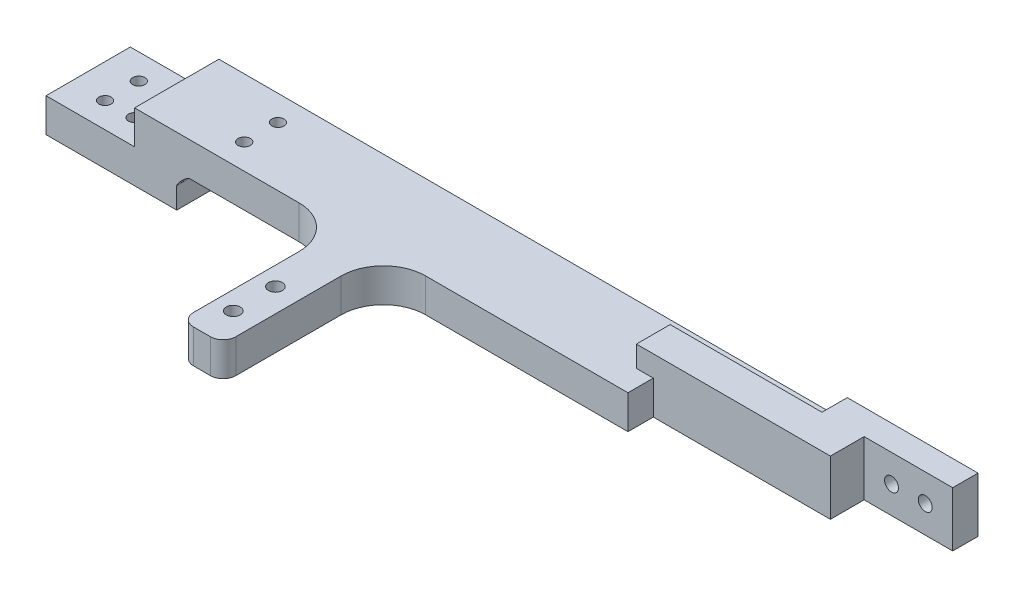
ISO-10303-21;
HEADER;
FILE_DESCRIPTION(('STEP AP214'),'2;1');
FILE_NAME('part.step','',(''),(''),'','','');
FILE_SCHEMA(('AUTOMOTIVE_DESIGN { 1 0 10303 214 1 1 1 1 }'));
ENDSEC;
DATA;
#1=APPLICATION_CONTEXT('core data for automotive mechanical design processes');
#2=APPLICATION_PROTOCOL_DEFINITION('international standard','automotive_design',2000,#1);
#3=PRODUCT_CONTEXT('',#1,'mechanical');
#4=PRODUCT('Part','Part','',(#3));
#5=PRODUCT_RELATED_PRODUCT_CATEGORY('part','',(#4));
#6=PRODUCT_DEFINITION_FORMATION('','',#4);
#7=PRODUCT_DEFINITION_CONTEXT('part definition',#1,'design');
#8=PRODUCT_DEFINITION('design','',#6,#7);
#9=PRODUCT_DEFINITION_SHAPE('','',#8);
#10=(LENGTH_UNIT() NAMED_UNIT(*) SI_UNIT(.MILLI.,.METRE.));
#11=(NAMED_UNIT(*) PLANE_ANGLE_UNIT() SI_UNIT($,.RADIAN.));
#12=(NAMED_UNIT(*) SI_UNIT($,.STERADIAN.) SOLID_ANGLE_UNIT());
#13=UNCERTAINTY_MEASURE_WITH_UNIT(LENGTH_MEASURE(1.E-05),#10,'distance_accuracy_value','');
#14=(GEOMETRIC_REPRESENTATION_CONTEXT(3) GLOBAL_UNCERTAINTY_ASSIGNED_CONTEXT((#13)) GLOBAL_UNIT_ASSIGNED_CONTEXT((#10,
#11,#12)) REPRESENTATION_CONTEXT('',''));
#15=CARTESIAN_POINT('',(0.,0.,0.));
#16=DIRECTION('',(0.,0.,1.));
#17=DIRECTION('',(1.,0.,0.));
#18=AXIS2_PLACEMENT_3D('',#15,#16,#17);
#19=CARTESIAN_POINT('',(0.,8.,20.));
#20=DIRECTION('',(0.,0.,-1.));
#21=DIRECTION('',(-1.,0.,0.));
#22=AXIS2_PLACEMENT_3D('',#19,#20,#21);
#23=PLANE('',#22);
#24=DIRECTION('',(0.,1.,0.));
#25=VECTOR('',#24,1.);
#26=CARTESIAN_POINT('',(68.,-8.,20.));
#27=LINE('',#26,#25);
#28=CARTESIAN_POINT('',(68.,-8.,20.));
#29=VERTEX_POINT('',#28);
#30=CARTESIAN_POINT('',(68.,-3.,20.));
#31=VERTEX_POINT('',#30);
#32=EDGE_CURVE('E491',#29,#31,#27,.T.);
#33=ORIENTED_EDGE('',*,*,#32,.T.);
#34=CARTESIAN_POINT('',(71.,0.,20.));
#35=CARTESIAN_POINT('',(68.,0.,20.));
#36=CARTESIAN_POINT('',(68.,-3.,20.));
#37=(BOUNDED_CURVE() B_SPLINE_CURVE(2,(#34,#35,#36),.UNSPECIFIED.,.F.,
.F.) B_SPLINE_CURVE_WITH_KNOTS((3,3),(0.,1.),
.UNSPECIFIED.) CURVE() GEOMETRIC_REPRESENTATION_ITEM() RATIONAL_B_SPLINE_CURVE((1.,
0.176470588235294,1.)) REPRESENTATION_ITEM(''));
#38=CARTESIAN_POINT('',(71.,0.,20.));
#39=VERTEX_POINT('',#38);
#40=EDGE_CURVE('E348',#31,#39,#37,.F.);
#41=ORIENTED_EDGE('',*,*,#40,.T.);
#42=DIRECTION('',(1.,0.,0.));
#43=VECTOR('',#42,1.);
#44=CARTESIAN_POINT('',(0.,0.,20.));
#45=LINE('',#44,#43);
#46=CARTESIAN_POINT('',(97.,0.,20.));
#47=VERTEX_POINT('',#46);
#48=EDGE_CURVE('E294',#39,#47,#45,.T.);
#49=ORIENTED_EDGE('',*,*,#48,.T.);
#50=DIRECTION('',(0.,-1.,0.));
#51=VECTOR('',#50,1.);
#52=CARTESIAN_POINT('',(97.,8.,20.));
#53=LINE('',#52,#51);
#54=CARTESIAN_POINT('',(97.,8.,20.));
#55=VERTEX_POINT('',#54);
#56=EDGE_CURVE('E600',#47,#55,#53,.F.);
#57=ORIENTED_EDGE('',*,*,#56,.T.);
#58=DIRECTION('',(1.,0.,0.));
#59=VECTOR('',#58,1.);
#60=CARTESIAN_POINT('',(0.,8.,20.));
#61=LINE('',#60,#59);
#62=CARTESIAN_POINT('',(58.,8.,20.));
#63=VERTEX_POINT('',#62);
#64=EDGE_CURVE('E284',#63,#55,#61,.T.);
#65=ORIENTED_EDGE('',*,*,#64,.F.);
#66=DIRECTION('',(0.,1.,0.));
#67=VECTOR('',#66,1.);
#68=CARTESIAN_POINT('',(58.,0.,20.));
#69=LINE('',#68,#67);
#70=CARTESIAN_POINT('',(58.,0.,20.));
#71=VERTEX_POINT('',#70);
#72=EDGE_CURVE('E225',#71,#63,#69,.T.);
#73=ORIENTED_EDGE('',*,*,#72,.F.);
#74=DIRECTION('',(1.,0.,0.));
#75=VECTOR('',#74,1.);
#76=CARTESIAN_POINT('',(37.,0.,20.));
#77=LINE('',#76,#75);
#78=CARTESIAN_POINT('',(37.,0.,20.));
#79=VERTEX_POINT('',#78);
#80=EDGE_CURVE('E210',#79,#71,#77,.T.);
#81=ORIENTED_EDGE('',*,*,#80,.F.);
#82=DIRECTION('',(0.,-1.,0.));
#83=VECTOR('',#82,1.);
#84=CARTESIAN_POINT('',(37.,8.,20.));
#85=LINE('',#84,#83);
#86=CARTESIAN_POINT('',(37.,-8.,20.));
#87=VERTEX_POINT('',#86);
#88=EDGE_CURVE('E222',#79,#87,#85,.T.);
#89=ORIENTED_EDGE('',*,*,#88,.T.);
#90=DIRECTION('',(-1.,0.,0.));
#91=VECTOR('',#90,1.);
#92=CARTESIAN_POINT('',(37.,-8.,20.));
#93=LINE('',#92,#91);
#94=EDGE_CURVE('E489',#29,#87,#93,.T.);
#95=ORIENTED_EDGE('',*,*,#94,.F.);
#96=EDGE_LOOP('',(#33,#41,#49,#57,#65,#73,#81,#89,#95));
#97=FACE_BOUND('',#96,.T.);
#98=ADVANCED_FACE('F39',(#97),#23,.F.);
#99=CARTESIAN_POINT('',(127.,8.,20.));
#100=VERTEX_POINT('',#99);
#101=CARTESIAN_POINT('',(175.,8.,20.));
#102=VERTEX_POINT('',#101);
#103=EDGE_CURVE('E288',#100,#102,#61,.T.);
#104=ORIENTED_EDGE('',*,*,#103,.F.);
#105=DIRECTION('',(0.,1.,0.));
#106=VECTOR('',#105,1.);
#107=CARTESIAN_POINT('',(127.,0.,20.));
#108=LINE('',#107,#106);
#109=CARTESIAN_POINT('',(127.,0.,20.));
#110=VERTEX_POINT('',#109);
#111=EDGE_CURVE('E588',#100,#110,#108,.F.);
#112=ORIENTED_EDGE('',*,*,#111,.T.);
#113=CARTESIAN_POINT('',(175.,0.,20.));
#114=VERTEX_POINT('',#113);
#115=EDGE_CURVE('E283',#110,#114,#45,.T.);
#116=ORIENTED_EDGE('',*,*,#115,.T.);
#117=DIRECTION('',(0.,1.,0.));
#118=VECTOR('',#117,1.);
#119=CARTESIAN_POINT('',(175.,-5.00000000000186,20.));
#120=LINE('',#119,#118);
#121=EDGE_CURVE('E253',#114,#102,#120,.T.);
#122=ORIENTED_EDGE('',*,*,#121,.T.);
#123=EDGE_LOOP('',(#104,#112,#116,#122));
#124=FACE_BOUND('',#123,.T.);
#125=ADVANCED_FACE('F550',(#124),#23,.F.);
#126=CARTESIAN_POINT('',(37.,0.,0.));
#127=DIRECTION('',(1.,0.,0.));
#128=DIRECTION('',(0.,0.,-1.));
#129=AXIS2_PLACEMENT_3D('',#126,#127,#128);
#130=PLANE('',#129);
#131=DIRECTION('',(0.,0.,1.));
#132=VECTOR('',#131,1.);
#133=CARTESIAN_POINT('',(37.,0.,0.));
#134=LINE('',#133,#132);
#135=CARTESIAN_POINT('',(37.,0.,0.));
#136=VERTEX_POINT('',#135);
#137=EDGE_CURVE('E206',#136,#79,#134,.T.);
#138=ORIENTED_EDGE('',*,*,#137,.F.);
#139=DIRECTION('',(0.,1.,0.));
#140=VECTOR('',#139,1.);
#141=CARTESIAN_POINT('',(37.,8.,0.));
#142=LINE('',#141,#140);
#143=CARTESIAN_POINT('',(37.,-8.,0.));
#144=VERTEX_POINT('',#143);
#145=EDGE_CURVE('E232',#144,#136,#142,.T.);
#146=ORIENTED_EDGE('',*,*,#145,.F.);
#147=DIRECTION('',(0.,0.,-1.));
#148=VECTOR('',#147,1.);
#149=CARTESIAN_POINT('',(37.,-8.,20.));
#150=LINE('',#149,#148);
#151=EDGE_CURVE('E231',#87,#144,#150,.T.);
#152=ORIENTED_EDGE('',*,*,#151,.F.);
#153=ORIENTED_EDGE('',*,*,#88,.F.);
#154=EDGE_LOOP('',(#138,#146,#152,#153));
#155=FACE_BOUND('',#154,.T.);
#156=ADVANCED_FACE('F229',(#155),#130,.F.);
#157=CARTESIAN_POINT('',(0.,0.,0.));
#158=DIRECTION('',(0.,1.,0.));
#159=DIRECTION('',(0.,0.,1.));
#160=AXIS2_PLACEMENT_3D('',#157,#158,#159);
#161=PLANE('',#160);
#162=CARTESIAN_POINT('',(111.4,0.,40.));
#163=DIRECTION('',(0.,1.,0.));
#164=DIRECTION('',(0.,0.,1.));
#165=AXIS2_PLACEMENT_3D('',#162,#163,#164);
#166=CIRCLE('',#165,1.65);
#167=CARTESIAN_POINT('',(111.4,0.,41.65));
#168=VERTEX_POINT('',#167);
#169=EDGE_CURVE('E1090',#168,#168,#166,.T.);
#170=ORIENTED_EDGE('',*,*,#169,.T.);
#171=EDGE_LOOP('',(#170));
#172=FACE_BOUND('',#171,.T.);
#173=CARTESIAN_POINT('',(111.4,0.,50.));
#174=DIRECTION('',(0.,1.,0.));
#175=DIRECTION('',(0.,0.,1.));
#176=AXIS2_PLACEMENT_3D('',#173,#174,#175);
#177=CIRCLE('',#176,1.65);
#178=CARTESIAN_POINT('',(111.4,0.,51.65));
#179=VERTEX_POINT('',#178);
#180=EDGE_CURVE('E435',#179,#179,#177,.T.);
#181=ORIENTED_EDGE('',*,*,#180,.T.);
#182=EDGE_LOOP('',(#181));
#183=FACE_BOUND('',#182,.T.);
#184=CARTESIAN_POINT('',(78.,0.,6.));
#185=DIRECTION('',(0.,1.,0.));
#186=DIRECTION('',(0.,0.,1.));
#187=AXIS2_PLACEMENT_3D('',#184,#185,#186);
#188=CIRCLE('',#187,1.45);
#189=CARTESIAN_POINT('',(78.,0.,7.45));
#190=VERTEX_POINT('',#189);
#191=EDGE_CURVE('E248',#190,#190,#188,.T.);
#192=ORIENTED_EDGE('',*,*,#191,.T.);
#193=EDGE_LOOP('',(#192));
#194=FACE_BOUND('',#193,.T.);
#195=CARTESIAN_POINT('',(78.,0.,14.));
#196=DIRECTION('',(0.,1.,0.));
#197=DIRECTION('',(0.,0.,1.));
#198=AXIS2_PLACEMENT_3D('',#195,#196,#197);
#199=CIRCLE('',#198,1.45);
#200=CARTESIAN_POINT('',(78.,0.,15.45));
#201=VERTEX_POINT('',#200);
#202=EDGE_CURVE('E244',#201,#201,#199,.T.);
#203=ORIENTED_EDGE('',*,*,#202,.T.);
#204=EDGE_LOOP('',(#203));
#205=FACE_BOUND('',#204,.T.);
#206=DIRECTION('',(0.,0.,-1.));
#207=VECTOR('',#206,1.);
#208=CARTESIAN_POINT('',(117.,0.,58.));
#209=LINE('',#208,#207);
#210=CARTESIAN_POINT('',(117.,0.,55.));
#211=VERTEX_POINT('',#210);
#212=CARTESIAN_POINT('',(117.,0.,30.));
#213=VERTEX_POINT('',#212);
#214=EDGE_CURVE('E426',#211,#213,#209,.T.);
#215=ORIENTED_EDGE('',*,*,#214,.F.);
#216=CARTESIAN_POINT('',(114.,0.,55.));
#217=DIRECTION('',(0.,1.,0.));
#218=DIRECTION('',(0.,0.,1.));
#219=AXIS2_PLACEMENT_3D('',#216,#217,#218);
#220=CIRCLE('',#219,3.);
#221=CARTESIAN_POINT('',(114.,0.,58.));
#222=VERTEX_POINT('',#221);
#223=EDGE_CURVE('E47',#211,#222,#220,.F.);
#224=ORIENTED_EDGE('',*,*,#223,.T.);
#225=DIRECTION('',(1.,0.,0.));
#226=VECTOR('',#225,1.);
#227=CARTESIAN_POINT('',(107.,0.,58.));
#228=LINE('',#227,#226);
#229=CARTESIAN_POINT('',(110.,0.,58.));
#230=VERTEX_POINT('',#229);
#231=EDGE_CURVE('E424',#230,#222,#228,.T.);
#232=ORIENTED_EDGE('',*,*,#231,.F.);
#233=CARTESIAN_POINT('',(110.,0.,55.));
#234=DIRECTION('',(0.,1.,0.));
#235=DIRECTION('',(0.,0.,1.));
#236=AXIS2_PLACEMENT_3D('',#233,#234,#235);
#237=CIRCLE('',#236,3.);
#238=CARTESIAN_POINT('',(107.,0.,55.));
#239=VERTEX_POINT('',#238);
#240=EDGE_CURVE('E54',#230,#239,#237,.F.);
#241=ORIENTED_EDGE('',*,*,#240,.T.);
#242=DIRECTION('',(0.,0.,-1.));
#243=VECTOR('',#242,1.);
#244=CARTESIAN_POINT('',(107.,0.,58.));
#245=LINE('',#244,#243);
#246=CARTESIAN_POINT('',(107.,0.,30.));
#247=VERTEX_POINT('',#246);
#248=EDGE_CURVE('E447',#239,#247,#245,.T.);
#249=ORIENTED_EDGE('',*,*,#248,.T.);
#250=CARTESIAN_POINT('',(97.,0.,30.));
#251=DIRECTION('',(0.,1.,0.));
#252=DIRECTION('',(0.,0.,1.));
#253=AXIS2_PLACEMENT_3D('',#250,#251,#252);
#254=CIRCLE('',#253,10.);
#255=EDGE_CURVE('E595',#247,#47,#254,.T.);
#256=ORIENTED_EDGE('',*,*,#255,.T.);
#257=ORIENTED_EDGE('',*,*,#48,.F.);
#258=CARTESIAN_POINT('',(71.,0.,-1.));
#259=CARTESIAN_POINT('',(71.,0.,6.33333333333335));
#260=CARTESIAN_POINT('',(71.,0.,13.6666666666666));
#261=CARTESIAN_POINT('',(71.,0.,21.));
#262=(BOUNDED_CURVE() B_SPLINE_CURVE(3,(#258,#259,#260,#261),.UNSPECIFIED.,.F.,
.F.) B_SPLINE_CURVE_WITH_KNOTS((4,4),(-0.001,0.021),
.UNSPECIFIED.) CURVE() GEOMETRIC_REPRESENTATION_ITEM() RATIONAL_B_SPLINE_CURVE((1.,1.,1.,1.)) REPRESENTATION_ITEM(''));
#263=CARTESIAN_POINT('',(71.,0.,0.));
#264=VERTEX_POINT('',#263);
#265=EDGE_CURVE('E306',#39,#264,#262,.F.);
#266=ORIENTED_EDGE('',*,*,#265,.T.);
#267=DIRECTION('',(-1.,0.,0.));
#268=VECTOR('',#267,1.);
#269=CARTESIAN_POINT('',(0.,0.,0.));
#270=LINE('',#269,#268);
#271=CARTESIAN_POINT('',(238.,0.,0.));
#272=VERTEX_POINT('',#271);
#273=EDGE_CURVE('E300',#272,#264,#270,.T.);
#274=ORIENTED_EDGE('',*,*,#273,.F.);
#275=DIRECTION('',(0.,0.,1.));
#276=VECTOR('',#275,1.);
#277=CARTESIAN_POINT('',(238.,0.,0.));
#278=LINE('',#277,#276);
#279=CARTESIAN_POINT('',(238.,0.,6.00000000000001));
#280=VERTEX_POINT('',#279);
#281=EDGE_CURVE('E238',#272,#280,#278,.T.);
#282=ORIENTED_EDGE('',*,*,#281,.T.);
#283=DIRECTION('',(1.,0.,0.));
#284=VECTOR('',#283,1.);
#285=CARTESIAN_POINT('',(217.,0.,6.00000000000001));
#286=LINE('',#285,#284);
#287=CARTESIAN_POINT('',(217.,0.,6.00000000000001));
#288=VERTEX_POINT('',#287);
#289=EDGE_CURVE('E648',#288,#280,#286,.T.);
#290=ORIENTED_EDGE('',*,*,#289,.F.);
#291=DIRECTION('',(0.,0.,-1.));
#292=VECTOR('',#291,1.);
#293=CARTESIAN_POINT('',(217.,0.,6.00000000000001));
#294=LINE('',#293,#292);
#295=CARTESIAN_POINT('',(217.,0.,14.));
#296=VERTEX_POINT('',#295);
#297=EDGE_CURVE('E645',#296,#288,#294,.T.);
#298=ORIENTED_EDGE('',*,*,#297,.F.);
#299=DIRECTION('',(1.,0.,0.));
#300=VECTOR('',#299,1.);
#301=CARTESIAN_POINT('',(241.,0.,14.));
#302=LINE('',#301,#300);
#303=CARTESIAN_POINT('',(175.,0.,14.));
#304=VERTEX_POINT('',#303);
#305=EDGE_CURVE('E278',#304,#296,#302,.T.);
#306=ORIENTED_EDGE('',*,*,#305,.F.);
#307=DIRECTION('',(0.,0.,1.));
#308=VECTOR('',#307,1.);
#309=CARTESIAN_POINT('',(175.,0.,0.));
#310=LINE('',#309,#308);
#311=EDGE_CURVE('E256',#304,#114,#310,.T.);
#312=ORIENTED_EDGE('',*,*,#311,.T.);
#313=ORIENTED_EDGE('',*,*,#115,.F.);
#314=CARTESIAN_POINT('',(127.,0.,30.));
#315=DIRECTION('',(0.,1.,0.));
#316=DIRECTION('',(0.,0.,1.));
#317=AXIS2_PLACEMENT_3D('',#314,#315,#316);
#318=CIRCLE('',#317,10.);
#319=EDGE_CURVE('E500',#110,#213,#318,.T.);
#320=ORIENTED_EDGE('',*,*,#319,.T.);
#321=EDGE_LOOP('',(#215,#224,#232,#241,#249,#256,#257,#266,#274,#282,#290,#298,#306,#312,#313,#320));
#322=FACE_BOUND('',#321,.T.);
#323=ADVANCED_FACE('F313',(#172,#183,#194,#205,#322),#161,.F.);
#324=CARTESIAN_POINT('',(0.,8.,0.));
#325=DIRECTION('',(0.,1.,0.));
#326=DIRECTION('',(0.,0.,1.));
#327=AXIS2_PLACEMENT_3D('',#324,#325,#326);
#328=PLANE('',#327);
#329=CARTESIAN_POINT('',(111.4,8.,40.));
#330=DIRECTION('',(0.,1.,0.));
#331=DIRECTION('',(0.,0.,1.));
#332=AXIS2_PLACEMENT_3D('',#329,#330,#331);
#333=CIRCLE('',#332,1.65);
#334=CARTESIAN_POINT('',(111.4,8.,41.65));
#335=VERTEX_POINT('',#334);
#336=EDGE_CURVE('E1095',#335,#335,#333,.T.);
#337=ORIENTED_EDGE('',*,*,#336,.F.);
#338=EDGE_LOOP('',(#337));
#339=FACE_BOUND('',#338,.T.);
#340=CARTESIAN_POINT('',(111.4,8.,50.));
#341=DIRECTION('',(0.,1.,0.));
#342=DIRECTION('',(0.,0.,1.));
#343=AXIS2_PLACEMENT_3D('',#340,#341,#342);
#344=CIRCLE('',#343,1.65);
#345=CARTESIAN_POINT('',(111.4,8.,51.65));
#346=VERTEX_POINT('',#345);
#347=EDGE_CURVE('E1085',#346,#346,#344,.T.);
#348=ORIENTED_EDGE('',*,*,#347,.F.);
#349=EDGE_LOOP('',(#348));
#350=FACE_BOUND('',#349,.T.);
#351=DIRECTION('',(-1.,0.,0.));
#352=VECTOR('',#351,1.);
#353=CARTESIAN_POINT('',(107.,8.,58.));
#354=LINE('',#353,#352);
#355=CARTESIAN_POINT('',(114.,8.,58.));
#356=VERTEX_POINT('',#355);
#357=CARTESIAN_POINT('',(110.,8.,58.));
#358=VERTEX_POINT('',#357);
#359=EDGE_CURVE('E434',#356,#358,#354,.T.);
#360=ORIENTED_EDGE('',*,*,#359,.F.);
#361=CARTESIAN_POINT('',(114.,8.,55.));
#362=DIRECTION('',(0.,1.,0.));
#363=DIRECTION('',(0.,0.,1.));
#364=AXIS2_PLACEMENT_3D('',#361,#362,#363);
#365=CIRCLE('',#364,3.);
#366=CARTESIAN_POINT('',(117.,8.,55.));
#367=VERTEX_POINT('',#366);
#368=EDGE_CURVE('E419',#356,#367,#365,.T.);
#369=ORIENTED_EDGE('',*,*,#368,.T.);
#370=DIRECTION('',(0.,0.,-1.));
#371=VECTOR('',#370,1.);
#372=CARTESIAN_POINT('',(117.,8.,58.));
#373=LINE('',#372,#371);
#374=CARTESIAN_POINT('',(117.,8.,30.));
#375=VERTEX_POINT('',#374);
#376=EDGE_CURVE('E439',#367,#375,#373,.T.);
#377=ORIENTED_EDGE('',*,*,#376,.T.);
#378=CARTESIAN_POINT('',(127.,8.,30.));
#379=DIRECTION('',(0.,1.,0.));
#380=DIRECTION('',(0.,0.,1.));
#381=AXIS2_PLACEMENT_3D('',#378,#379,#380);
#382=CIRCLE('',#381,10.);
#383=EDGE_CURVE('E594',#375,#100,#382,.F.);
#384=ORIENTED_EDGE('',*,*,#383,.T.);
#385=ORIENTED_EDGE('',*,*,#103,.T.);
#386=DIRECTION('',(0.,0.,1.));
#387=VECTOR('',#386,1.);
#388=CARTESIAN_POINT('',(175.,8.,14.));
#389=LINE('',#388,#387);
#390=CARTESIAN_POINT('',(175.,8.,14.));
#391=VERTEX_POINT('',#390);
#392=EDGE_CURVE('E249',#391,#102,#389,.T.);
#393=ORIENTED_EDGE('',*,*,#392,.F.);
#394=DIRECTION('',(1.,0.,0.));
#395=VECTOR('',#394,1.);
#396=CARTESIAN_POINT('',(241.,8.,14.));
#397=LINE('',#396,#395);
#398=CARTESIAN_POINT('',(171.,8.,14.));
#399=VERTEX_POINT('',#398);
#400=EDGE_CURVE('E264',#399,#391,#397,.T.);
#401=ORIENTED_EDGE('',*,*,#400,.F.);
#402=DIRECTION('',(0.,0.,1.));
#403=VECTOR('',#402,1.);
#404=CARTESIAN_POINT('',(171.,8.,14.));
#405=LINE('',#404,#403);
#406=CARTESIAN_POINT('',(171.,8.,6.00000000000001));
#407=VERTEX_POINT('',#406);
#408=EDGE_CURVE('E260',#407,#399,#405,.T.);
#409=ORIENTED_EDGE('',*,*,#408,.F.);
#410=DIRECTION('',(-1.,0.,0.));
#411=VECTOR('',#410,1.);
#412=CARTESIAN_POINT('',(241.,8.,6.00000000000001));
#413=LINE('',#412,#411);
#414=CARTESIAN_POINT('',(207.,8.,6.00000000000001));
#415=VERTEX_POINT('',#414);
#416=EDGE_CURVE('E281',#415,#407,#413,.T.);
#417=ORIENTED_EDGE('',*,*,#416,.F.);
#418=DIRECTION('',(0.,0.,1.));
#419=VECTOR('',#418,1.);
#420=CARTESIAN_POINT('',(207.,8.,6.00000000000001));
#421=LINE('',#420,#419);
#422=CARTESIAN_POINT('',(207.,8.,0.));
#423=VERTEX_POINT('',#422);
#424=EDGE_CURVE('E617',#423,#415,#421,.T.);
#425=ORIENTED_EDGE('',*,*,#424,.F.);
#426=DIRECTION('',(-1.,0.,0.));
#427=VECTOR('',#426,1.);
#428=CARTESIAN_POINT('',(0.,8.,0.));
#429=LINE('',#428,#427);
#430=CARTESIAN_POINT('',(58.,8.,0.));
#431=VERTEX_POINT('',#430);
#432=EDGE_CURVE('E287',#423,#431,#429,.T.);
#433=ORIENTED_EDGE('',*,*,#432,.T.);
#434=DIRECTION('',(0.,0.,-1.));
#435=VECTOR('',#434,1.);
#436=CARTESIAN_POINT('',(58.,8.,0.));
#437=LINE('',#436,#435);
#438=EDGE_CURVE('E217',#63,#431,#437,.T.);
#439=ORIENTED_EDGE('',*,*,#438,.F.);
#440=ORIENTED_EDGE('',*,*,#64,.T.);
#441=CARTESIAN_POINT('',(97.,8.,30.));
#442=DIRECTION('',(0.,1.,0.));
#443=DIRECTION('',(0.,0.,1.));
#444=AXIS2_PLACEMENT_3D('',#441,#442,#443);
#445=CIRCLE('',#444,10.);
#446=CARTESIAN_POINT('',(107.,8.,30.));
#447=VERTEX_POINT('',#446);
#448=EDGE_CURVE('E598',#55,#447,#445,.F.);
#449=ORIENTED_EDGE('',*,*,#448,.T.);
#450=DIRECTION('',(0.,0.,-1.));
#451=VECTOR('',#450,1.);
#452=CARTESIAN_POINT('',(107.,8.,58.));
#453=LINE('',#452,#451);
#454=CARTESIAN_POINT('',(107.,8.,55.));
#455=VERTEX_POINT('',#454);
#456=EDGE_CURVE('E445',#455,#447,#453,.T.);
#457=ORIENTED_EDGE('',*,*,#456,.F.);
#458=CARTESIAN_POINT('',(110.,8.,55.));
#459=DIRECTION('',(0.,1.,0.));
#460=DIRECTION('',(0.,0.,1.));
#461=AXIS2_PLACEMENT_3D('',#458,#459,#460);
#462=CIRCLE('',#461,3.);
#463=EDGE_CURVE('E417',#455,#358,#462,.T.);
#464=ORIENTED_EDGE('',*,*,#463,.T.);
#465=EDGE_LOOP('',(#360,#369,#377,#384,#385,#393,#401,#409,#417,#425,#433,#439,#440,#449,#457,#464));
#466=FACE_BOUND('',#465,.T.);
#467=CARTESIAN_POINT('',(78.,8.,14.));
#468=DIRECTION('',(0.,1.,0.));
#469=DIRECTION('',(0.,0.,1.));
#470=AXIS2_PLACEMENT_3D('',#467,#468,#469);
#471=CIRCLE('',#470,1.45);
#472=CARTESIAN_POINT('',(78.,8.,15.45));
#473=VERTEX_POINT('',#472);
#474=EDGE_CURVE('E235',#473,#473,#471,.T.);
#475=ORIENTED_EDGE('',*,*,#474,.F.);
#476=EDGE_LOOP('',(#475));
#477=FACE_BOUND('',#476,.T.);
#478=CARTESIAN_POINT('',(78.,8.,6.));
#479=DIRECTION('',(0.,1.,0.));
#480=DIRECTION('',(0.,0.,1.));
#481=AXIS2_PLACEMENT_3D('',#478,#479,#480);
#482=CIRCLE('',#481,1.45);
#483=CARTESIAN_POINT('',(78.,8.,7.45));
#484=VERTEX_POINT('',#483);
#485=EDGE_CURVE('E245',#484,#484,#482,.T.);
#486=ORIENTED_EDGE('',*,*,#485,.F.);
#487=EDGE_LOOP('',(#486));
#488=FACE_BOUND('',#487,.T.);
#489=ADVANCED_FACE('F323',(#339,#350,#466,#477,#488),#328,.T.);
#490=CARTESIAN_POINT('',(241.,22.,6.00000000000001));
#491=DIRECTION('',(0.,0.,1.));
#492=DIRECTION('',(1.,0.,0.));
#493=AXIS2_PLACEMENT_3D('',#490,#491,#492);
#494=PLANE('',#493);
#495=DIRECTION('',(0.,-1.,0.));
#496=VECTOR('',#495,1.);
#497=CARTESIAN_POINT('',(207.,13.,6.00000000000001));
#498=LINE('',#497,#496);
#499=CARTESIAN_POINT('',(207.,13.,6.00000000000001));
#500=VERTEX_POINT('',#499);
#501=EDGE_CURVE('E633',#500,#415,#498,.T.);
#502=ORIENTED_EDGE('',*,*,#501,.T.);
#503=ORIENTED_EDGE('',*,*,#416,.T.);
#504=DIRECTION('',(0.,-1.,0.));
#505=VECTOR('',#504,1.);
#506=CARTESIAN_POINT('',(171.,13.,6.00000000000001));
#507=LINE('',#506,#505);
#508=CARTESIAN_POINT('',(171.,13.,6.00000000000001));
#509=VERTEX_POINT('',#508);
#510=EDGE_CURVE('E275',#509,#407,#507,.T.);
#511=ORIENTED_EDGE('',*,*,#510,.F.);
#512=DIRECTION('',(-1.,0.,0.));
#513=VECTOR('',#512,1.);
#514=CARTESIAN_POINT('',(241.,13.,6.00000000000001));
#515=LINE('',#514,#513);
#516=EDGE_CURVE('E261',#500,#509,#515,.T.);
#517=ORIENTED_EDGE('',*,*,#516,.F.);
#518=EDGE_LOOP('',(#502,#503,#511,#517));
#519=FACE_BOUND('',#518,.T.);
#520=ADVANCED_FACE('F331',(#519),#494,.F.);
#521=CARTESIAN_POINT('',(0.,8.,0.));
#522=DIRECTION('',(0.,0.,1.));
#523=DIRECTION('',(1.,0.,0.));
#524=AXIS2_PLACEMENT_3D('',#521,#522,#523);
#525=PLANE('',#524);
#526=CARTESIAN_POINT('',(223.5,6.5,0.));
#527=DIRECTION('',(0.,0.,1.));
#528=DIRECTION('',(1.,0.,0.));
#529=AXIS2_PLACEMENT_3D('',#526,#527,#528);
#530=CIRCLE('',#529,1.65000000000002);
#531=CARTESIAN_POINT('',(225.15,6.5,0.));
#532=VERTEX_POINT('',#531);
#533=EDGE_CURVE('E664',#532,#532,#530,.T.);
#534=ORIENTED_EDGE('',*,*,#533,.T.);
#535=EDGE_LOOP('',(#534));
#536=FACE_BOUND('',#535,.T.);
#537=CARTESIAN_POINT('',(231.5,6.5,0.));
#538=DIRECTION('',(0.,0.,1.));
#539=DIRECTION('',(1.,0.,0.));
#540=AXIS2_PLACEMENT_3D('',#537,#538,#539);
#541=CIRCLE('',#540,1.65000000000002);
#542=CARTESIAN_POINT('',(233.15,6.5,0.));
#543=VERTEX_POINT('',#542);
#544=EDGE_CURVE('E621',#543,#543,#541,.T.);
#545=ORIENTED_EDGE('',*,*,#544,.T.);
#546=EDGE_LOOP('',(#545));
#547=FACE_BOUND('',#546,.T.);
#548=DIRECTION('',(-1.,0.,0.));
#549=VECTOR('',#548,1.);
#550=CARTESIAN_POINT('',(37.,0.,0.));
#551=LINE('',#550,#549);
#552=CARTESIAN_POINT('',(58.,0.,0.));
#553=VERTEX_POINT('',#552);
#554=EDGE_CURVE('E213',#553,#136,#551,.T.);
#555=ORIENTED_EDGE('',*,*,#554,.F.);
#556=DIRECTION('',(0.,1.,0.));
#557=VECTOR('',#556,1.);
#558=CARTESIAN_POINT('',(58.,0.,0.));
#559=LINE('',#558,#557);
#560=EDGE_CURVE('E480',#553,#431,#559,.T.);
#561=ORIENTED_EDGE('',*,*,#560,.T.);
#562=ORIENTED_EDGE('',*,*,#432,.F.);
#563=DIRECTION('',(0.,-1.,0.));
#564=VECTOR('',#563,1.);
#565=CARTESIAN_POINT('',(207.,13.,0.));
#566=LINE('',#565,#564);
#567=CARTESIAN_POINT('',(207.,13.,0.));
#568=VERTEX_POINT('',#567);
#569=EDGE_CURVE('E635',#568,#423,#566,.T.);
#570=ORIENTED_EDGE('',*,*,#569,.F.);
#571=DIRECTION('',(-1.,0.,0.));
#572=VECTOR('',#571,1.);
#573=CARTESIAN_POINT('',(238.,13.,0.));
#574=LINE('',#573,#572);
#575=CARTESIAN_POINT('',(238.,13.,0.));
#576=VERTEX_POINT('',#575);
#577=EDGE_CURVE('E624',#576,#568,#574,.T.);
#578=ORIENTED_EDGE('',*,*,#577,.F.);
#579=DIRECTION('',(0.,-1.,0.));
#580=VECTOR('',#579,1.);
#581=CARTESIAN_POINT('',(238.,8.,0.));
#582=LINE('',#581,#580);
#583=EDGE_CURVE('E233',#576,#272,#582,.T.);
#584=ORIENTED_EDGE('',*,*,#583,.T.);
#585=ORIENTED_EDGE('',*,*,#273,.T.);
#586=CARTESIAN_POINT('',(68.,-3.,0.));
#587=CARTESIAN_POINT('',(68.,0.,0.));
#588=CARTESIAN_POINT('',(71.,0.,0.));
#589=(BOUNDED_CURVE() B_SPLINE_CURVE(2,(#586,#587,#588),.UNSPECIFIED.,.F.,
.F.) B_SPLINE_CURVE_WITH_KNOTS((3,3),(0.,1.),
.UNSPECIFIED.) CURVE() GEOMETRIC_REPRESENTATION_ITEM() RATIONAL_B_SPLINE_CURVE((1.,
0.176470588235294,1.)) REPRESENTATION_ITEM(''));
#590=CARTESIAN_POINT('',(68.,-3.,0.));
#591=VERTEX_POINT('',#590);
#592=EDGE_CURVE('E414',#264,#591,#589,.F.);
#593=ORIENTED_EDGE('',*,*,#592,.T.);
#594=DIRECTION('',(0.,1.,0.));
#595=VECTOR('',#594,1.);
#596=CARTESIAN_POINT('',(68.,-8.,0.));
#597=LINE('',#596,#595);
#598=CARTESIAN_POINT('',(68.,-8.,0.));
#599=VERTEX_POINT('',#598);
#600=EDGE_CURVE('E499',#599,#591,#597,.T.);
#601=ORIENTED_EDGE('',*,*,#600,.F.);
#602=DIRECTION('',(1.,0.,0.));
#603=VECTOR('',#602,1.);
#604=CARTESIAN_POINT('',(37.,-8.,0.));
#605=LINE('',#604,#603);
#606=EDGE_CURVE('E485',#144,#599,#605,.T.);
#607=ORIENTED_EDGE('',*,*,#606,.F.);
#608=ORIENTED_EDGE('',*,*,#145,.T.);
#609=EDGE_LOOP('',(#555,#561,#562,#570,#578,#584,#585,#593,#601,#607,#608));
#610=FACE_BOUND('',#609,.T.);
#611=ADVANCED_FACE('F326',(#536,#547,#610),#525,.F.);
#612=CARTESIAN_POINT('',(241.,14.,14.));
#613=DIRECTION('',(0.,0.,-1.));
#614=DIRECTION('',(-1.,0.,0.));
#615=AXIS2_PLACEMENT_3D('',#612,#613,#614);
#616=PLANE('',#615);
#617=ORIENTED_EDGE('',*,*,#305,.T.);
#618=DIRECTION('',(0.,-1.,0.));
#619=VECTOR('',#618,1.);
#620=CARTESIAN_POINT('',(217.,13.,14.));
#621=LINE('',#620,#619);
#622=CARTESIAN_POINT('',(217.,13.,14.));
#623=VERTEX_POINT('',#622);
#624=EDGE_CURVE('E643',#623,#296,#621,.T.);
#625=ORIENTED_EDGE('',*,*,#624,.F.);
#626=DIRECTION('',(1.,0.,0.));
#627=VECTOR('',#626,1.);
#628=CARTESIAN_POINT('',(241.,13.,14.));
#629=LINE('',#628,#627);
#630=CARTESIAN_POINT('',(171.,13.,14.));
#631=VERTEX_POINT('',#630);
#632=EDGE_CURVE('E266',#631,#623,#629,.T.);
#633=ORIENTED_EDGE('',*,*,#632,.F.);
#634=DIRECTION('',(0.,-1.,0.));
#635=VECTOR('',#634,1.);
#636=CARTESIAN_POINT('',(171.,13.,14.));
#637=LINE('',#636,#635);
#638=EDGE_CURVE('E269',#631,#399,#637,.T.);
#639=ORIENTED_EDGE('',*,*,#638,.T.);
#640=ORIENTED_EDGE('',*,*,#400,.T.);
#641=DIRECTION('',(0.,1.,0.));
#642=VECTOR('',#641,1.);
#643=CARTESIAN_POINT('',(175.,-5.00000000000186,14.));
#644=LINE('',#643,#642);
#645=EDGE_CURVE('E252',#304,#391,#644,.T.);
#646=ORIENTED_EDGE('',*,*,#645,.F.);
#647=EDGE_LOOP('',(#617,#625,#633,#639,#640,#646));
#648=FACE_BOUND('',#647,.T.);
#649=ADVANCED_FACE('F330',(#648),#616,.F.);
#650=CARTESIAN_POINT('',(171.,13.,14.));
#651=DIRECTION('',(1.,0.,0.));
#652=DIRECTION('',(0.,0.,-1.));
#653=AXIS2_PLACEMENT_3D('',#650,#651,#652);
#654=PLANE('',#653);
#655=ORIENTED_EDGE('',*,*,#408,.T.);
#656=ORIENTED_EDGE('',*,*,#638,.F.);
#657=DIRECTION('',(0.,0.,1.));
#658=VECTOR('',#657,1.);
#659=CARTESIAN_POINT('',(171.,13.,14.));
#660=LINE('',#659,#658);
#661=EDGE_CURVE('E263',#509,#631,#660,.T.);
#662=ORIENTED_EDGE('',*,*,#661,.F.);
#663=ORIENTED_EDGE('',*,*,#510,.T.);
#664=EDGE_LOOP('',(#655,#656,#662,#663));
#665=FACE_BOUND('',#664,.T.);
#666=ADVANCED_FACE('F565',(#665),#654,.F.);
#667=CARTESIAN_POINT('',(0.,13.,0.));
#668=DIRECTION('',(0.,-1.,0.));
#669=DIRECTION('',(0.,0.,-1.));
#670=AXIS2_PLACEMENT_3D('',#667,#668,#669);
#671=PLANE('',#670);
#672=ORIENTED_EDGE('',*,*,#632,.T.);
#673=DIRECTION('',(0.,0.,1.));
#674=VECTOR('',#673,1.);
#675=CARTESIAN_POINT('',(217.,13.,6.00000000000001));
#676=LINE('',#675,#674);
#677=CARTESIAN_POINT('',(217.,13.,6.00000000000001));
#678=VERTEX_POINT('',#677);
#679=EDGE_CURVE('E641',#678,#623,#676,.T.);
#680=ORIENTED_EDGE('',*,*,#679,.F.);
#681=DIRECTION('',(1.,0.,0.));
#682=VECTOR('',#681,1.);
#683=CARTESIAN_POINT('',(238.,13.,6.00000000000001));
#684=LINE('',#683,#682);
#685=CARTESIAN_POINT('',(238.,13.,6.00000000000001));
#686=VERTEX_POINT('',#685);
#687=EDGE_CURVE('E631',#678,#686,#684,.T.);
#688=ORIENTED_EDGE('',*,*,#687,.T.);
#689=DIRECTION('',(0.,0.,-1.));
#690=VECTOR('',#689,1.);
#691=CARTESIAN_POINT('',(238.,13.,6.00000000000001));
#692=LINE('',#691,#690);
#693=EDGE_CURVE('E620',#686,#576,#692,.T.);
#694=ORIENTED_EDGE('',*,*,#693,.T.);
#695=ORIENTED_EDGE('',*,*,#577,.T.);
#696=DIRECTION('',(0.,0.,1.));
#697=VECTOR('',#696,1.);
#698=CARTESIAN_POINT('',(207.,13.,6.00000000000001));
#699=LINE('',#698,#697);
#700=EDGE_CURVE('E657',#568,#500,#699,.T.);
#701=ORIENTED_EDGE('',*,*,#700,.T.);
#702=ORIENTED_EDGE('',*,*,#516,.T.);
#703=ORIENTED_EDGE('',*,*,#661,.T.);
#704=EDGE_LOOP('',(#672,#680,#688,#694,#695,#701,#702,#703));
#705=FACE_BOUND('',#704,.T.);
#706=ADVANCED_FACE('F561',(#705),#671,.F.);
#707=CARTESIAN_POINT('',(175.,-5.00000000000186,14.));
#708=DIRECTION('',(-1.,0.,0.));
#709=DIRECTION('',(0.,0.,1.));
#710=AXIS2_PLACEMENT_3D('',#707,#708,#709);
#711=PLANE('',#710);
#712=ORIENTED_EDGE('',*,*,#645,.T.);
#713=ORIENTED_EDGE('',*,*,#392,.T.);
#714=ORIENTED_EDGE('',*,*,#121,.F.);
#715=ORIENTED_EDGE('',*,*,#311,.F.);
#716=EDGE_LOOP('',(#712,#713,#714,#715));
#717=FACE_BOUND('',#716,.T.);
#718=ADVANCED_FACE('F557',(#717),#711,.F.);
#719=CARTESIAN_POINT('',(78.,-5.00000000000186,6.));
#720=DIRECTION('',(0.,1.,0.));
#721=DIRECTION('',(0.,0.,1.));
#722=AXIS2_PLACEMENT_3D('',#719,#720,#721);
#723=CYLINDRICAL_SURFACE('',#722,1.45);
#724=ORIENTED_EDGE('',*,*,#485,.T.);
#725=EDGE_LOOP('',(#724));
#726=FACE_BOUND('',#725,.T.);
#727=ORIENTED_EDGE('',*,*,#191,.F.);
#728=EDGE_LOOP('',(#727));
#729=FACE_BOUND('',#728,.T.);
#730=ADVANCED_FACE('F553',(#726,#729),#723,.F.);
#731=CARTESIAN_POINT('',(78.,-5.00000000000186,14.));
#732=DIRECTION('',(0.,1.,0.));
#733=DIRECTION('',(0.,0.,1.));
#734=AXIS2_PLACEMENT_3D('',#731,#732,#733);
#735=CYLINDRICAL_SURFACE('',#734,1.45);
#736=ORIENTED_EDGE('',*,*,#474,.T.);
#737=EDGE_LOOP('',(#736));
#738=FACE_BOUND('',#737,.T.);
#739=ORIENTED_EDGE('',*,*,#202,.F.);
#740=EDGE_LOOP('',(#739));
#741=FACE_BOUND('',#740,.T.);
#742=ADVANCED_FACE('F546',(#738,#741),#735,.F.);
#743=CARTESIAN_POINT('',(238.,0.,0.));
#744=DIRECTION('',(-1.,0.,0.));
#745=DIRECTION('',(0.,0.,1.));
#746=AXIS2_PLACEMENT_3D('',#743,#744,#745);
#747=PLANE('',#746);
#748=ORIENTED_EDGE('',*,*,#583,.F.);
#749=ORIENTED_EDGE('',*,*,#693,.F.);
#750=DIRECTION('',(0.,1.,0.));
#751=VECTOR('',#750,1.);
#752=CARTESIAN_POINT('',(238.,13.,6.00000000000001));
#753=LINE('',#752,#751);
#754=EDGE_CURVE('E637',#280,#686,#753,.T.);
#755=ORIENTED_EDGE('',*,*,#754,.F.);
#756=ORIENTED_EDGE('',*,*,#281,.F.);
#757=EDGE_LOOP('',(#748,#749,#755,#756));
#758=FACE_BOUND('',#757,.T.);
#759=ADVANCED_FACE('F542',(#758),#747,.F.);
#760=CARTESIAN_POINT('',(217.,13.,6.00000000000001));
#761=DIRECTION('',(0.,0.,-1.));
#762=DIRECTION('',(-1.,0.,0.));
#763=AXIS2_PLACEMENT_3D('',#760,#761,#762);
#764=PLANE('',#763);
#765=CARTESIAN_POINT('',(223.5,6.5,6.00000000000001));
#766=DIRECTION('',(0.,0.,1.));
#767=DIRECTION('',(1.,0.,0.));
#768=AXIS2_PLACEMENT_3D('',#765,#766,#767);
#769=CIRCLE('',#768,1.65000000000002);
#770=CARTESIAN_POINT('',(225.15,6.5,6.00000000000001));
#771=VERTEX_POINT('',#770);
#772=EDGE_CURVE('E504',#771,#771,#769,.T.);
#773=ORIENTED_EDGE('',*,*,#772,.F.);
#774=EDGE_LOOP('',(#773));
#775=FACE_BOUND('',#774,.T.);
#776=CARTESIAN_POINT('',(231.5,6.5,6.00000000000001));
#777=DIRECTION('',(0.,0.,1.));
#778=DIRECTION('',(1.,0.,0.));
#779=AXIS2_PLACEMENT_3D('',#776,#777,#778);
#780=CIRCLE('',#779,1.65000000000002);
#781=CARTESIAN_POINT('',(233.15,6.5,6.00000000000001));
#782=VERTEX_POINT('',#781);
#783=EDGE_CURVE('E627',#782,#782,#780,.T.);
#784=ORIENTED_EDGE('',*,*,#783,.F.);
#785=EDGE_LOOP('',(#784));
#786=FACE_BOUND('',#785,.T.);
#787=ORIENTED_EDGE('',*,*,#754,.T.);
#788=ORIENTED_EDGE('',*,*,#687,.F.);
#789=DIRECTION('',(0.,1.,0.));
#790=VECTOR('',#789,1.);
#791=CARTESIAN_POINT('',(217.,13.,6.00000000000001));
#792=LINE('',#791,#790);
#793=EDGE_CURVE('E638',#288,#678,#792,.T.);
#794=ORIENTED_EDGE('',*,*,#793,.F.);
#795=ORIENTED_EDGE('',*,*,#289,.T.);
#796=EDGE_LOOP('',(#787,#788,#794,#795));
#797=FACE_BOUND('',#796,.T.);
#798=ADVANCED_FACE('F538',(#775,#786,#797),#764,.F.);
#799=CARTESIAN_POINT('',(217.,0.,0.));
#800=DIRECTION('',(-1.,0.,0.));
#801=DIRECTION('',(0.,0.,1.));
#802=AXIS2_PLACEMENT_3D('',#799,#800,#801);
#803=PLANE('',#802);
#804=ORIENTED_EDGE('',*,*,#297,.T.);
#805=ORIENTED_EDGE('',*,*,#793,.T.);
#806=ORIENTED_EDGE('',*,*,#679,.T.);
#807=ORIENTED_EDGE('',*,*,#624,.T.);
#808=EDGE_LOOP('',(#804,#805,#806,#807));
#809=FACE_BOUND('',#808,.T.);
#810=ADVANCED_FACE('F534',(#809),#803,.F.);
#811=CARTESIAN_POINT('',(207.,13.,6.00000000000001));
#812=DIRECTION('',(1.,0.,0.));
#813=DIRECTION('',(0.,0.,-1.));
#814=AXIS2_PLACEMENT_3D('',#811,#812,#813);
#815=PLANE('',#814);
#816=ORIENTED_EDGE('',*,*,#424,.T.);
#817=ORIENTED_EDGE('',*,*,#501,.F.);
#818=ORIENTED_EDGE('',*,*,#700,.F.);
#819=ORIENTED_EDGE('',*,*,#569,.T.);
#820=EDGE_LOOP('',(#816,#817,#818,#819));
#821=FACE_BOUND('',#820,.T.);
#822=ADVANCED_FACE('F530',(#821),#815,.F.);
#823=CARTESIAN_POINT('',(231.5,6.5,0.));
#824=DIRECTION('',(0.,0.,1.));
#825=DIRECTION('',(1.,0.,0.));
#826=AXIS2_PLACEMENT_3D('',#823,#824,#825);
#827=CYLINDRICAL_SURFACE('',#826,1.65000000000002);
#828=ORIENTED_EDGE('',*,*,#544,.F.);
#829=EDGE_LOOP('',(#828));
#830=FACE_BOUND('',#829,.T.);
#831=ORIENTED_EDGE('',*,*,#783,.T.);
#832=EDGE_LOOP('',(#831));
#833=FACE_BOUND('',#832,.T.);
#834=ADVANCED_FACE('F526',(#830,#833),#827,.F.);
#835=CARTESIAN_POINT('',(223.5,6.5,0.));
#836=DIRECTION('',(0.,0.,1.));
#837=DIRECTION('',(1.,0.,0.));
#838=AXIS2_PLACEMENT_3D('',#835,#836,#837);
#839=CYLINDRICAL_SURFACE('',#838,1.65000000000002);
#840=ORIENTED_EDGE('',*,*,#533,.F.);
#841=EDGE_LOOP('',(#840));
#842=FACE_BOUND('',#841,.T.);
#843=ORIENTED_EDGE('',*,*,#772,.T.);
#844=EDGE_LOOP('',(#843));
#845=FACE_BOUND('',#844,.T.);
#846=ADVANCED_FACE('F522',(#842,#845),#839,.F.);
#847=CARTESIAN_POINT('',(68.,-8.,20.));
#848=DIRECTION('',(-1.,0.,0.));
#849=DIRECTION('',(0.,0.,1.));
#850=AXIS2_PLACEMENT_3D('',#847,#848,#849);
#851=PLANE('',#850);
#852=ORIENTED_EDGE('',*,*,#600,.T.);
#853=CARTESIAN_POINT('',(68.,-3.,21.));
#854=CARTESIAN_POINT('',(68.,-3.,13.6666666666666));
#855=CARTESIAN_POINT('',(68.,-3.,6.33333333333335));
#856=CARTESIAN_POINT('',(68.,-3.,-1.));
#857=(BOUNDED_CURVE() B_SPLINE_CURVE(3,(#853,#854,#855,#856),.UNSPECIFIED.,.F.,
.F.) B_SPLINE_CURVE_WITH_KNOTS((4,4),(-0.001,0.021),
.UNSPECIFIED.) CURVE() GEOMETRIC_REPRESENTATION_ITEM() RATIONAL_B_SPLINE_CURVE((1.,1.,1.,1.)) REPRESENTATION_ITEM(''));
#858=EDGE_CURVE('E507',#591,#31,#857,.F.);
#859=ORIENTED_EDGE('',*,*,#858,.T.);
#860=ORIENTED_EDGE('',*,*,#32,.F.);
#861=DIRECTION('',(0.,0.,1.));
#862=VECTOR('',#861,1.);
#863=CARTESIAN_POINT('',(68.,-8.,20.));
#864=LINE('',#863,#862);
#865=EDGE_CURVE('E487',#599,#29,#864,.T.);
#866=ORIENTED_EDGE('',*,*,#865,.F.);
#867=EDGE_LOOP('',(#852,#859,#860,#866));
#868=FACE_BOUND('',#867,.T.);
#869=ADVANCED_FACE('F511',(#868),#851,.F.);
#870=CARTESIAN_POINT('',(0.,-8.,0.));
#871=DIRECTION('',(0.,-1.,0.));
#872=DIRECTION('',(0.,0.,-1.));
#873=AXIS2_PLACEMENT_3D('',#870,#871,#872);
#874=PLANE('',#873);
#875=CARTESIAN_POINT('',(45.,-8.,6.));
#876=DIRECTION('',(0.,1.,0.));
#877=DIRECTION('',(0.,0.,1.));
#878=AXIS2_PLACEMENT_3D('',#875,#876,#877);
#879=CIRCLE('',#878,1.45);
#880=CARTESIAN_POINT('',(45.,-8.,7.45));
#881=VERTEX_POINT('',#880);
#882=EDGE_CURVE('E454',#881,#881,#879,.T.);
#883=ORIENTED_EDGE('',*,*,#882,.T.);
#884=EDGE_LOOP('',(#883));
#885=FACE_BOUND('',#884,.T.);
#886=CARTESIAN_POINT('',(45.,-8.,14.));
#887=DIRECTION('',(0.,1.,0.));
#888=DIRECTION('',(0.,0.,1.));
#889=AXIS2_PLACEMENT_3D('',#886,#887,#888);
#890=CIRCLE('',#889,1.45);
#891=CARTESIAN_POINT('',(45.,-8.,15.45));
#892=VERTEX_POINT('',#891);
#893=EDGE_CURVE('E461',#892,#892,#890,.T.);
#894=ORIENTED_EDGE('',*,*,#893,.T.);
#895=EDGE_LOOP('',(#894));
#896=FACE_BOUND('',#895,.T.);
#897=CARTESIAN_POINT('',(52.,-8.,14.));
#898=DIRECTION('',(0.,1.,0.));
#899=DIRECTION('',(0.,0.,1.));
#900=AXIS2_PLACEMENT_3D('',#897,#898,#899);
#901=CIRCLE('',#900,1.45);
#902=CARTESIAN_POINT('',(52.,-8.,15.45));
#903=VERTEX_POINT('',#902);
#904=EDGE_CURVE('E467',#903,#903,#901,.T.);
#905=ORIENTED_EDGE('',*,*,#904,.T.);
#906=EDGE_LOOP('',(#905));
#907=FACE_BOUND('',#906,.T.);
#908=CARTESIAN_POINT('',(52.,-8.,6.));
#909=DIRECTION('',(0.,1.,0.));
#910=DIRECTION('',(0.,0.,1.));
#911=AXIS2_PLACEMENT_3D('',#908,#909,#910);
#912=CIRCLE('',#911,1.45);
#913=CARTESIAN_POINT('',(52.,-8.,7.45));
#914=VERTEX_POINT('',#913);
#915=EDGE_CURVE('E472',#914,#914,#912,.T.);
#916=ORIENTED_EDGE('',*,*,#915,.T.);
#917=EDGE_LOOP('',(#916));
#918=FACE_BOUND('',#917,.T.);
#919=ORIENTED_EDGE('',*,*,#151,.T.);
#920=ORIENTED_EDGE('',*,*,#606,.T.);
#921=ORIENTED_EDGE('',*,*,#865,.T.);
#922=ORIENTED_EDGE('',*,*,#94,.T.);
#923=EDGE_LOOP('',(#919,#920,#921,#922));
#924=FACE_BOUND('',#923,.T.);
#925=ADVANCED_FACE('F521',(#885,#896,#907,#918,#924),#874,.T.);
#926=CARTESIAN_POINT('',(58.,0.,0.));
#927=DIRECTION('',(1.,0.,0.));
#928=DIRECTION('',(0.,0.,-1.));
#929=AXIS2_PLACEMENT_3D('',#926,#927,#928);
#930=PLANE('',#929);
#931=ORIENTED_EDGE('',*,*,#438,.T.);
#932=ORIENTED_EDGE('',*,*,#560,.F.);
#933=DIRECTION('',(0.,0.,-1.));
#934=VECTOR('',#933,1.);
#935=CARTESIAN_POINT('',(58.,0.,0.));
#936=LINE('',#935,#934);
#937=EDGE_CURVE('E226',#71,#553,#936,.T.);
#938=ORIENTED_EDGE('',*,*,#937,.F.);
#939=ORIENTED_EDGE('',*,*,#72,.T.);
#940=EDGE_LOOP('',(#931,#932,#938,#939));
#941=FACE_BOUND('',#940,.T.);
#942=ADVANCED_FACE('F803',(#941),#930,.F.);
#943=CARTESIAN_POINT('',(0.,0.,0.));
#944=DIRECTION('',(0.,1.,0.));
#945=DIRECTION('',(0.,0.,1.));
#946=AXIS2_PLACEMENT_3D('',#943,#944,#945);
#947=PLANE('',#946);
#948=CARTESIAN_POINT('',(45.,0.,6.));
#949=DIRECTION('',(0.,1.,0.));
#950=DIRECTION('',(0.,0.,1.));
#951=AXIS2_PLACEMENT_3D('',#948,#949,#950);
#952=CIRCLE('',#951,1.45);
#953=CARTESIAN_POINT('',(45.,0.,7.45));
#954=VERTEX_POINT('',#953);
#955=EDGE_CURVE('E458',#954,#954,#952,.T.);
#956=ORIENTED_EDGE('',*,*,#955,.F.);
#957=EDGE_LOOP('',(#956));
#958=FACE_BOUND('',#957,.T.);
#959=CARTESIAN_POINT('',(45.,0.,14.));
#960=DIRECTION('',(0.,1.,0.));
#961=DIRECTION('',(0.,0.,1.));
#962=AXIS2_PLACEMENT_3D('',#959,#960,#961);
#963=CIRCLE('',#962,1.45);
#964=CARTESIAN_POINT('',(45.,0.,15.45));
#965=VERTEX_POINT('',#964);
#966=EDGE_CURVE('E464',#965,#965,#963,.T.);
#967=ORIENTED_EDGE('',*,*,#966,.F.);
#968=EDGE_LOOP('',(#967));
#969=FACE_BOUND('',#968,.T.);
#970=CARTESIAN_POINT('',(52.,0.,14.));
#971=DIRECTION('',(0.,1.,0.));
#972=DIRECTION('',(0.,0.,1.));
#973=AXIS2_PLACEMENT_3D('',#970,#971,#972);
#974=CIRCLE('',#973,1.45);
#975=CARTESIAN_POINT('',(52.,0.,15.45));
#976=VERTEX_POINT('',#975);
#977=EDGE_CURVE('E453',#976,#976,#974,.T.);
#978=ORIENTED_EDGE('',*,*,#977,.F.);
#979=EDGE_LOOP('',(#978));
#980=FACE_BOUND('',#979,.T.);
#981=CARTESIAN_POINT('',(52.,0.,6.));
#982=DIRECTION('',(0.,1.,0.));
#983=DIRECTION('',(0.,0.,1.));
#984=AXIS2_PLACEMENT_3D('',#981,#982,#983);
#985=CIRCLE('',#984,1.45);
#986=CARTESIAN_POINT('',(52.,0.,7.45));
#987=VERTEX_POINT('',#986);
#988=EDGE_CURVE('E457',#987,#987,#985,.T.);
#989=ORIENTED_EDGE('',*,*,#988,.F.);
#990=EDGE_LOOP('',(#989));
#991=FACE_BOUND('',#990,.T.);
#992=ORIENTED_EDGE('',*,*,#137,.T.);
#993=ORIENTED_EDGE('',*,*,#80,.T.);
#994=ORIENTED_EDGE('',*,*,#937,.T.);
#995=ORIENTED_EDGE('',*,*,#554,.T.);
#996=EDGE_LOOP('',(#992,#993,#994,#995));
#997=FACE_BOUND('',#996,.T.);
#998=ADVANCED_FACE('F208',(#958,#969,#980,#991,#997),#947,.T.);
#999=CARTESIAN_POINT('',(52.,-8.,6.));
#1000=DIRECTION('',(0.,1.,0.));
#1001=DIRECTION('',(0.,0.,1.));
#1002=AXIS2_PLACEMENT_3D('',#999,#1000,#1001);
#1003=CYLINDRICAL_SURFACE('',#1002,1.45);
#1004=ORIENTED_EDGE('',*,*,#915,.F.);
#1005=EDGE_LOOP('',(#1004));
#1006=FACE_BOUND('',#1005,.T.);
#1007=ORIENTED_EDGE('',*,*,#988,.T.);
#1008=EDGE_LOOP('',(#1007));
#1009=FACE_BOUND('',#1008,.T.);
#1010=ADVANCED_FACE('F788',(#1006,#1009),#1003,.F.);
#1011=CARTESIAN_POINT('',(52.,-8.,14.));
#1012=DIRECTION('',(0.,1.,0.));
#1013=DIRECTION('',(0.,0.,1.));
#1014=AXIS2_PLACEMENT_3D('',#1011,#1012,#1013);
#1015=CYLINDRICAL_SURFACE('',#1014,1.45);
#1016=ORIENTED_EDGE('',*,*,#904,.F.);
#1017=EDGE_LOOP('',(#1016));
#1018=FACE_BOUND('',#1017,.T.);
#1019=ORIENTED_EDGE('',*,*,#977,.T.);
#1020=EDGE_LOOP('',(#1019));
#1021=FACE_BOUND('',#1020,.T.);
#1022=ADVANCED_FACE('F780',(#1018,#1021),#1015,.F.);
#1023=CARTESIAN_POINT('',(45.,-8.,14.));
#1024=DIRECTION('',(0.,1.,0.));
#1025=DIRECTION('',(0.,0.,1.));
#1026=AXIS2_PLACEMENT_3D('',#1023,#1024,#1025);
#1027=CYLINDRICAL_SURFACE('',#1026,1.45);
#1028=ORIENTED_EDGE('',*,*,#893,.F.);
#1029=EDGE_LOOP('',(#1028));
#1030=FACE_BOUND('',#1029,.T.);
#1031=ORIENTED_EDGE('',*,*,#966,.T.);
#1032=EDGE_LOOP('',(#1031));
#1033=FACE_BOUND('',#1032,.T.);
#1034=ADVANCED_FACE('F772',(#1030,#1033),#1027,.F.);
#1035=CARTESIAN_POINT('',(45.,-8.,6.));
#1036=DIRECTION('',(0.,1.,0.));
#1037=DIRECTION('',(0.,0.,1.));
#1038=AXIS2_PLACEMENT_3D('',#1035,#1036,#1037);
#1039=CYLINDRICAL_SURFACE('',#1038,1.45);
#1040=ORIENTED_EDGE('',*,*,#882,.F.);
#1041=EDGE_LOOP('',(#1040));
#1042=FACE_BOUND('',#1041,.T.);
#1043=ORIENTED_EDGE('',*,*,#955,.T.);
#1044=EDGE_LOOP('',(#1043));
#1045=FACE_BOUND('',#1044,.T.);
#1046=ADVANCED_FACE('F765',(#1042,#1045),#1039,.F.);
#1047=CARTESIAN_POINT('',(107.,0.,58.));
#1048=DIRECTION('',(1.,0.,0.));
#1049=DIRECTION('',(0.,0.,-1.));
#1050=AXIS2_PLACEMENT_3D('',#1047,#1048,#1049);
#1051=PLANE('',#1050);
#1052=ORIENTED_EDGE('',*,*,#248,.F.);
#1053=DIRECTION('',(0.,-1.,0.));
#1054=VECTOR('',#1053,1.);
#1055=CARTESIAN_POINT('',(107.,0.,55.));
#1056=LINE('',#1055,#1054);
#1057=EDGE_CURVE('E12',#239,#455,#1056,.F.);
#1058=ORIENTED_EDGE('',*,*,#1057,.T.);
#1059=ORIENTED_EDGE('',*,*,#456,.T.);
#1060=DIRECTION('',(0.,-1.,0.));
#1061=VECTOR('',#1060,1.);
#1062=CARTESIAN_POINT('',(107.,0.,30.));
#1063=LINE('',#1062,#1061);
#1064=EDGE_CURVE('E291',#447,#247,#1063,.T.);
#1065=ORIENTED_EDGE('',*,*,#1064,.T.);
#1066=EDGE_LOOP('',(#1052,#1058,#1059,#1065));
#1067=FACE_BOUND('',#1066,.T.);
#1068=ADVANCED_FACE('F702',(#1067),#1051,.F.);
#1069=CARTESIAN_POINT('',(117.,0.,58.));
#1070=DIRECTION('',(-1.,0.,0.));
#1071=DIRECTION('',(0.,0.,1.));
#1072=AXIS2_PLACEMENT_3D('',#1069,#1070,#1071);
#1073=PLANE('',#1072);
#1074=ORIENTED_EDGE('',*,*,#376,.F.);
#1075=DIRECTION('',(0.,1.,0.));
#1076=VECTOR('',#1075,1.);
#1077=CARTESIAN_POINT('',(117.,0.,55.));
#1078=LINE('',#1077,#1076);
#1079=EDGE_CURVE('E62',#367,#211,#1078,.F.);
#1080=ORIENTED_EDGE('',*,*,#1079,.T.);
#1081=ORIENTED_EDGE('',*,*,#214,.T.);
#1082=DIRECTION('',(0.,1.,0.));
#1083=VECTOR('',#1082,1.);
#1084=CARTESIAN_POINT('',(117.,8.,30.));
#1085=LINE('',#1084,#1083);
#1086=EDGE_CURVE('E444',#213,#375,#1085,.T.);
#1087=ORIENTED_EDGE('',*,*,#1086,.T.);
#1088=EDGE_LOOP('',(#1074,#1080,#1081,#1087));
#1089=FACE_BOUND('',#1088,.T.);
#1090=ADVANCED_FACE('F442',(#1089),#1073,.F.);
#1091=CARTESIAN_POINT('',(0.,0.,58.));
#1092=DIRECTION('',(0.,0.,-1.));
#1093=DIRECTION('',(-1.,0.,0.));
#1094=AXIS2_PLACEMENT_3D('',#1091,#1092,#1093);
#1095=PLANE('',#1094);
#1096=ORIENTED_EDGE('',*,*,#231,.T.);
#1097=DIRECTION('',(0.,1.,0.));
#1098=VECTOR('',#1097,1.);
#1099=CARTESIAN_POINT('',(114.,0.,58.));
#1100=LINE('',#1099,#1098);
#1101=EDGE_CURVE('E413',#222,#356,#1100,.T.);
#1102=ORIENTED_EDGE('',*,*,#1101,.T.);
#1103=ORIENTED_EDGE('',*,*,#359,.T.);
#1104=DIRECTION('',(0.,-1.,0.));
#1105=VECTOR('',#1104,1.);
#1106=CARTESIAN_POINT('',(110.,0.,58.));
#1107=LINE('',#1106,#1105);
#1108=EDGE_CURVE('E405',#358,#230,#1107,.T.);
#1109=ORIENTED_EDGE('',*,*,#1108,.T.);
#1110=EDGE_LOOP('',(#1096,#1102,#1103,#1109));
#1111=FACE_BOUND('',#1110,.T.);
#1112=ADVANCED_FACE('F430',(#1111),#1095,.F.);
#1113=CARTESIAN_POINT('',(111.4,-8.,50.));
#1114=DIRECTION('',(0.,1.,0.));
#1115=DIRECTION('',(0.,0.,1.));
#1116=AXIS2_PLACEMENT_3D('',#1113,#1114,#1115);
#1117=CYLINDRICAL_SURFACE('',#1116,1.65);
#1118=ORIENTED_EDGE('',*,*,#347,.T.);
#1119=EDGE_LOOP('',(#1118));
#1120=FACE_BOUND('',#1119,.T.);
#1121=ORIENTED_EDGE('',*,*,#180,.F.);
#1122=EDGE_LOOP('',(#1121));
#1123=FACE_BOUND('',#1122,.T.);
#1124=ADVANCED_FACE('F738',(#1120,#1123),#1117,.F.);
#1125=CARTESIAN_POINT('',(111.4,-8.,40.));
#1126=DIRECTION('',(0.,1.,0.));
#1127=DIRECTION('',(0.,0.,1.));
#1128=AXIS2_PLACEMENT_3D('',#1125,#1126,#1127);
#1129=CYLINDRICAL_SURFACE('',#1128,1.65);
#1130=ORIENTED_EDGE('',*,*,#336,.T.);
#1131=EDGE_LOOP('',(#1130));
#1132=FACE_BOUND('',#1131,.T.);
#1133=ORIENTED_EDGE('',*,*,#169,.F.);
#1134=EDGE_LOOP('',(#1133));
#1135=FACE_BOUND('',#1134,.T.);
#1136=ADVANCED_FACE('F732',(#1132,#1135),#1129,.F.);
#1137=CARTESIAN_POINT('',(97.,0.,30.));
#1138=DIRECTION('',(0.,1.,0.));
#1139=DIRECTION('',(0.,0.,1.));
#1140=AXIS2_PLACEMENT_3D('',#1137,#1138,#1139);
#1141=CYLINDRICAL_SURFACE('',#1140,10.);
#1142=ORIENTED_EDGE('',*,*,#448,.F.);
#1143=ORIENTED_EDGE('',*,*,#56,.F.);
#1144=ORIENTED_EDGE('',*,*,#255,.F.);
#1145=ORIENTED_EDGE('',*,*,#1064,.F.);
#1146=EDGE_LOOP('',(#1142,#1143,#1144,#1145));
#1147=FACE_BOUND('',#1146,.T.);
#1148=ADVANCED_FACE('F705',(#1147),#1141,.F.);
#1149=CARTESIAN_POINT('',(127.,0.,30.));
#1150=DIRECTION('',(0.,-1.,0.));
#1151=DIRECTION('',(0.,0.,-1.));
#1152=AXIS2_PLACEMENT_3D('',#1149,#1150,#1151);
#1153=CYLINDRICAL_SURFACE('',#1152,10.);
#1154=ORIENTED_EDGE('',*,*,#319,.F.);
#1155=ORIENTED_EDGE('',*,*,#111,.F.);
#1156=ORIENTED_EDGE('',*,*,#383,.F.);
#1157=ORIENTED_EDGE('',*,*,#1086,.F.);
#1158=EDGE_LOOP('',(#1154,#1155,#1156,#1157));
#1159=FACE_BOUND('',#1158,.T.);
#1160=ADVANCED_FACE('F369',(#1159),#1153,.F.);
#1161=CARTESIAN_POINT('',(71.,0.,21.));
#1162=CARTESIAN_POINT('',(71.,0.,13.6666666666666));
#1163=CARTESIAN_POINT('',(71.,0.,6.33333333333335));
#1164=CARTESIAN_POINT('',(71.,0.,-1.));
#1165=CARTESIAN_POINT('',(68.,0.,21.));
#1166=CARTESIAN_POINT('',(68.,0.,13.6666666666666));
#1167=CARTESIAN_POINT('',(68.,0.,6.33333333333335));
#1168=CARTESIAN_POINT('',(68.,0.,-1.));
#1169=CARTESIAN_POINT('',(68.,-3.,21.));
#1170=CARTESIAN_POINT('',(68.,-3.,13.6666666666666));
#1171=CARTESIAN_POINT('',(68.,-3.,6.33333333333335));
#1172=CARTESIAN_POINT('',(68.,-3.,-1.));
#1173=(BOUNDED_SURFACE() B_SPLINE_SURFACE(2,3,((#1161,#1162,#1163,#1164),(#1165,#1166,#1167,
#1168),(#1169,#1170,#1171,#1172)),.UNSPECIFIED.,.F.,.F.,.F.) B_SPLINE_SURFACE_WITH_KNOTS((3,3),
(4,4),(0.,1.),(-0.001,0.021),
.UNSPECIFIED.) GEOMETRIC_REPRESENTATION_ITEM() RATIONAL_B_SPLINE_SURFACE(((1.,1.,1.,1.),
(0.176470588235294,0.176470588235294,0.176470588235294,0.176470588235294),(1.,1.,1.,1.))) REPRESENTATION_ITEM('') SURFACE());
#1174=ORIENTED_EDGE('',*,*,#592,.F.);
#1175=ORIENTED_EDGE('',*,*,#265,.F.);
#1176=ORIENTED_EDGE('',*,*,#40,.F.);
#1177=ORIENTED_EDGE('',*,*,#858,.F.);
#1178=EDGE_LOOP('',(#1174,#1175,#1176,#1177));
#1179=FACE_BOUND('',#1178,.T.);
#1180=ADVANCED_FACE('F355',(#1179),#1173,.T.);
#1181=CARTESIAN_POINT('',(114.,0.,55.));
#1182=DIRECTION('',(0.,1.,0.));
#1183=DIRECTION('',(0.,0.,1.));
#1184=AXIS2_PLACEMENT_3D('',#1181,#1182,#1183);
#1185=CYLINDRICAL_SURFACE('',#1184,3.);
#1186=ORIENTED_EDGE('',*,*,#223,.F.);
#1187=ORIENTED_EDGE('',*,*,#1079,.F.);
#1188=ORIENTED_EDGE('',*,*,#368,.F.);
#1189=ORIENTED_EDGE('',*,*,#1101,.F.);
#1190=EDGE_LOOP('',(#1186,#1187,#1188,#1189));
#1191=FACE_BOUND('',#1190,.T.);
#1192=ADVANCED_FACE('F368',(#1191),#1185,.T.);
#1193=CARTESIAN_POINT('',(110.,0.,55.));
#1194=DIRECTION('',(0.,-1.,0.));
#1195=DIRECTION('',(0.,0.,-1.));
#1196=AXIS2_PLACEMENT_3D('',#1193,#1194,#1195);
#1197=CYLINDRICAL_SURFACE('',#1196,3.);
#1198=ORIENTED_EDGE('',*,*,#463,.F.);
#1199=ORIENTED_EDGE('',*,*,#1057,.F.);
#1200=ORIENTED_EDGE('',*,*,#240,.F.);
#1201=ORIENTED_EDGE('',*,*,#1108,.F.);
#1202=EDGE_LOOP('',(#1198,#1199,#1200,#1201));
#1203=FACE_BOUND('',#1202,.T.);
#1204=ADVANCED_FACE('F41',(#1203),#1197,.T.);
#1205=CLOSED_SHELL('',(#98,#125,#156,#323,#489,#520,#611,#649,#666,#706,#718,#730,#742,#759,
#798,#810,#822,#834,#846,#869,#925,#942,#998,#1010,#1022,#1034,#1046,#1068,#1090,#1112,#1124,
#1136,#1148,#1160,#1180,#1192,#1204));
#1206=MANIFOLD_SOLID_BREP('B2',#1205);
#1207=ADVANCED_BREP_SHAPE_REPRESENTATION('',(#18,#1206),#14);
#1208=SHAPE_DEFINITION_REPRESENTATION(#9,#1207);
ENDSEC;
END-ISO-10303-21;
